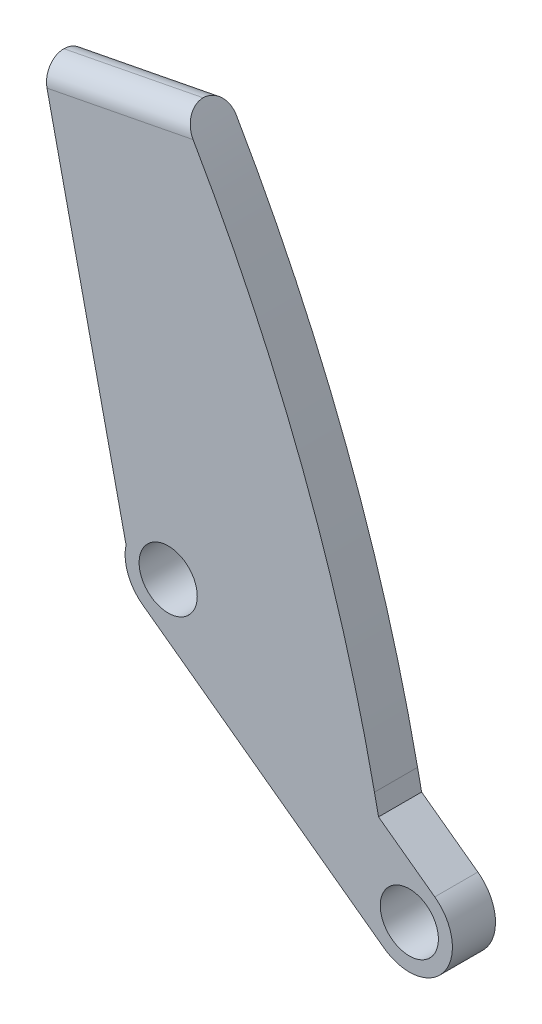
ISO-10303-21;
HEADER;
FILE_DESCRIPTION(('STEP AP214'),'2;1');
FILE_NAME('part.step','',(''),(''),'','','');
FILE_SCHEMA(('AUTOMOTIVE_DESIGN { 1 0 10303 214 1 1 1 1 }'));
ENDSEC;
DATA;
#1=APPLICATION_CONTEXT('core data for automotive mechanical design processes');
#2=APPLICATION_PROTOCOL_DEFINITION('international standard','automotive_design',2000,#1);
#3=PRODUCT_CONTEXT('',#1,'mechanical');
#4=PRODUCT('Part','Part','',(#3));
#5=PRODUCT_RELATED_PRODUCT_CATEGORY('part','',(#4));
#6=PRODUCT_DEFINITION_FORMATION('','',#4);
#7=PRODUCT_DEFINITION_CONTEXT('part definition',#1,'design');
#8=PRODUCT_DEFINITION('design','',#6,#7);
#9=PRODUCT_DEFINITION_SHAPE('','',#8);
#10=(LENGTH_UNIT() NAMED_UNIT(*) SI_UNIT(.MILLI.,.METRE.));
#11=(NAMED_UNIT(*) PLANE_ANGLE_UNIT() SI_UNIT($,.RADIAN.));
#12=(NAMED_UNIT(*) SI_UNIT($,.STERADIAN.) SOLID_ANGLE_UNIT());
#13=UNCERTAINTY_MEASURE_WITH_UNIT(LENGTH_MEASURE(1.E-05),#10,'distance_accuracy_value','');
#14=(GEOMETRIC_REPRESENTATION_CONTEXT(3) GLOBAL_UNCERTAINTY_ASSIGNED_CONTEXT((#13)) GLOBAL_UNIT_ASSIGNED_CONTEXT((#10,
#11,#12)) REPRESENTATION_CONTEXT('',''));
#15=CARTESIAN_POINT('',(0.,0.,0.));
#16=DIRECTION('',(0.,0.,1.));
#17=DIRECTION('',(1.,0.,0.));
#18=AXIS2_PLACEMENT_3D('',#15,#16,#17);
#19=CARTESIAN_POINT('',(-22.3860771891724,16.3777352873359,4.));
#20=DIRECTION('',(0.,0.,1.));
#21=DIRECTION('',(1.,0.,0.));
#22=AXIS2_PLACEMENT_3D('',#19,#20,#21);
#23=PLANE('',#22);
#24=CARTESIAN_POINT('',(-150.027791222216,-22.015529107945,4.));
#25=DIRECTION('',(0.,0.,1.));
#26=DIRECTION('',(1.,0.,0.));
#27=AXIS2_PLACEMENT_3D('',#24,#25,#26);
#28=CIRCLE('',#27,150.);
#29=CARTESIAN_POINT('',(-3.2367980067893,8.84551933226049,4.));
#30=VERTEX_POINT('',#29);
#31=CARTESIAN_POINT('',(-20.0719864820194,52.894342166327,4.));
#32=VERTEX_POINT('',#31);
#33=EDGE_CURVE('E167',#30,#32,#28,.T.);
#34=ORIENTED_EDGE('',*,*,#33,.T.);
#35=DIRECTION('',(-0.981560518740634,-0.191151636272403,0.));
#36=VECTOR('',#35,1.);
#37=CARTESIAN_POINT('',(-29.1530204691577,51.1258781006432,4.));
#38=LINE('',#37,#36);
#39=CARTESIAN_POINT('',(-33.635522206781,50.2529441089216,4.));
#40=VERTEX_POINT('',#39);
#41=EDGE_CURVE('E173',#32,#40,#38,.T.);
#42=ORIENTED_EDGE('',*,*,#41,.T.);
#43=DIRECTION('',(0.216697179931215,-0.976238870466577,0.));
#44=VECTOR('',#43,1.);
#45=CARTESIAN_POINT('',(-26.2997061545947,17.2044809078306,4.));
#46=LINE('',#45,#44);
#47=CARTESIAN_POINT('',(-26.2997061545947,17.2044809078306,4.));
#48=VERTEX_POINT('',#47);
#49=EDGE_CURVE('E135',#40,#48,#46,.T.);
#50=ORIENTED_EDGE('',*,*,#49,.T.);
#51=CARTESIAN_POINT('',(-22.3860771891724,16.3777352873359,4.));
#52=DIRECTION('',(0.,0.,1.));
#53=DIRECTION('',(1.,0.,0.));
#54=AXIS2_PLACEMENT_3D('',#51,#52,#53);
#55=CIRCLE('',#54,4.);
#56=CARTESIAN_POINT('',(-24.7478991474221,13.1494544696979,4.));
#57=VERTEX_POINT('',#56);
#58=EDGE_CURVE('E142',#48,#57,#55,.T.);
#59=ORIENTED_EDGE('',*,*,#58,.T.);
#60=DIRECTION('',(0.807070204409504,-0.590455489562423,0.));
#61=VECTOR('',#60,1.);
#62=CARTESIAN_POINT('',(-24.7478991474221,13.1494544696979,4.));
#63=LINE('',#62,#61);
#64=CARTESIAN_POINT('',(-2.36182195824969,-3.22828081763802,4.));
#65=VERTEX_POINT('',#64);
#66=EDGE_CURVE('E147',#57,#65,#63,.T.);
#67=ORIENTED_EDGE('',*,*,#66,.T.);
#68=CARTESIAN_POINT('',(0.,0.,4.));
#69=DIRECTION('',(0.,0.,1.));
#70=DIRECTION('',(1.,0.,0.));
#71=AXIS2_PLACEMENT_3D('',#68,#69,#70);
#72=CIRCLE('',#71,4.);
#73=CARTESIAN_POINT('',(2.36182195824969,3.22828081763802,4.));
#74=VERTEX_POINT('',#73);
#75=EDGE_CURVE('E244',#65,#74,#72,.T.);
#76=ORIENTED_EDGE('',*,*,#75,.T.);
#77=DIRECTION('',(-0.807070204409504,0.590455489562423,0.));
#78=VECTOR('',#77,1.);
#79=CARTESIAN_POINT('',(-20.0242552309227,19.6060161049739,4.));
#80=LINE('',#79,#78);
#81=CARTESIAN_POINT('',(-2.85883480044174,7.0477322426177,4.));
#82=VERTEX_POINT('',#81);
#83=EDGE_CURVE('E156',#74,#82,#80,.T.);
#84=ORIENTED_EDGE('',*,*,#83,.T.);
#85=DIRECTION('',(-0.205740322934703,0.978606621436174,0.));
#86=VECTOR('',#85,1.);
#87=CARTESIAN_POINT('',(-2.85883480044174,7.0477322426177,4.));
#88=LINE('',#87,#86);
#89=EDGE_CURVE('E119',#82,#30,#88,.T.);
#90=ORIENTED_EDGE('',*,*,#89,.T.);
#91=EDGE_LOOP('',(#34,#42,#50,#59,#67,#76,#84,#90));
#92=FACE_BOUND('',#91,.T.);
#93=CARTESIAN_POINT('',(0.,0.,4.));
#94=DIRECTION('',(0.,0.,1.));
#95=DIRECTION('',(1.,0.,0.));
#96=AXIS2_PLACEMENT_3D('',#93,#94,#95);
#97=CIRCLE('',#96,2.7);
#98=CARTESIAN_POINT('',(2.7,0.,4.));
#99=VERTEX_POINT('',#98);
#100=EDGE_CURVE('E253',#99,#99,#97,.T.);
#101=ORIENTED_EDGE('',*,*,#100,.F.);
#102=EDGE_LOOP('',(#101));
#103=FACE_BOUND('',#102,.T.);
#104=CARTESIAN_POINT('',(-22.3860771891724,16.3777352873359,4.));
#105=DIRECTION('',(0.,0.,1.));
#106=DIRECTION('',(1.,0.,0.));
#107=AXIS2_PLACEMENT_3D('',#104,#105,#106);
#108=CIRCLE('',#107,2.7);
#109=CARTESIAN_POINT('',(-19.6860771891724,16.3777352873359,4.));
#110=VERTEX_POINT('',#109);
#111=EDGE_CURVE('E263',#110,#110,#108,.T.);
#112=ORIENTED_EDGE('',*,*,#111,.F.);
#113=EDGE_LOOP('',(#112));
#114=FACE_BOUND('',#113,.T.);
#115=ADVANCED_FACE('F39',(#92,#103,#114),#23,.T.);
#116=CARTESIAN_POINT('',(-22.3860771891724,16.3777352873359,0.));
#117=DIRECTION('',(0.,0.,1.));
#118=DIRECTION('',(1.,0.,0.));
#119=AXIS2_PLACEMENT_3D('',#116,#117,#118);
#120=PLANE('',#119);
#121=DIRECTION('',(0.216697179931215,-0.976238870466577,0.));
#122=VECTOR('',#121,1.);
#123=CARTESIAN_POINT('',(-26.2997061545947,17.2044809078306,0.));
#124=LINE('',#123,#122);
#125=CARTESIAN_POINT('',(-33.635522206781,50.2529441089216,0.));
#126=VERTEX_POINT('',#125);
#127=CARTESIAN_POINT('',(-26.2997061545947,17.2044809078306,0.));
#128=VERTEX_POINT('',#127);
#129=EDGE_CURVE('E126',#126,#128,#124,.T.);
#130=ORIENTED_EDGE('',*,*,#129,.F.);
#131=DIRECTION('',(-0.981560518740634,-0.191151636272403,0.));
#132=VECTOR('',#131,1.);
#133=CARTESIAN_POINT('',(-20.7611964374901,52.76012363552,0.));
#134=LINE('',#133,#132);
#135=CARTESIAN_POINT('',(-20.0719864820194,52.894342166327,0.));
#136=VERTEX_POINT('',#135);
#137=EDGE_CURVE('E11',#126,#136,#134,.F.);
#138=ORIENTED_EDGE('',*,*,#137,.T.);
#139=CARTESIAN_POINT('',(-150.027791222216,-22.015529107945,0.));
#140=DIRECTION('',(0.,0.,1.));
#141=DIRECTION('',(1.,0.,0.));
#142=AXIS2_PLACEMENT_3D('',#139,#140,#141);
#143=CIRCLE('',#142,150.);
#144=CARTESIAN_POINT('',(-3.2367980067893,8.84551933226049,0.));
#145=VERTEX_POINT('',#144);
#146=EDGE_CURVE('E133',#136,#145,#143,.F.);
#147=ORIENTED_EDGE('',*,*,#146,.T.);
#148=DIRECTION('',(-0.205740322934703,0.978606621436174,0.));
#149=VECTOR('',#148,1.);
#150=CARTESIAN_POINT('',(-2.85883480044174,7.0477322426177,0.));
#151=LINE('',#150,#149);
#152=CARTESIAN_POINT('',(-2.85883480044174,7.0477322426177,0.));
#153=VERTEX_POINT('',#152);
#154=EDGE_CURVE('E116',#153,#145,#151,.T.);
#155=ORIENTED_EDGE('',*,*,#154,.F.);
#156=DIRECTION('',(-0.807070204409504,0.590455489562423,0.));
#157=VECTOR('',#156,1.);
#158=CARTESIAN_POINT('',(-20.0242552309227,19.6060161049739,0.));
#159=LINE('',#158,#157);
#160=CARTESIAN_POINT('',(2.36182195824969,3.22828081763802,0.));
#161=VERTEX_POINT('',#160);
#162=EDGE_CURVE('E132',#161,#153,#159,.T.);
#163=ORIENTED_EDGE('',*,*,#162,.F.);
#164=CARTESIAN_POINT('',(0.,0.,0.));
#165=DIRECTION('',(0.,0.,1.));
#166=DIRECTION('',(1.,0.,0.));
#167=AXIS2_PLACEMENT_3D('',#164,#165,#166);
#168=CIRCLE('',#167,4.);
#169=CARTESIAN_POINT('',(-2.36182195824969,-3.22828081763802,0.));
#170=VERTEX_POINT('',#169);
#171=EDGE_CURVE('E143',#170,#161,#168,.T.);
#172=ORIENTED_EDGE('',*,*,#171,.F.);
#173=DIRECTION('',(0.807070204409504,-0.590455489562423,0.));
#174=VECTOR('',#173,1.);
#175=CARTESIAN_POINT('',(-24.7478991474221,13.1494544696979,0.));
#176=LINE('',#175,#174);
#177=CARTESIAN_POINT('',(-24.7478991474221,13.1494544696979,0.));
#178=VERTEX_POINT('',#177);
#179=EDGE_CURVE('E149',#178,#170,#176,.T.);
#180=ORIENTED_EDGE('',*,*,#179,.F.);
#181=CARTESIAN_POINT('',(-22.3860771891724,16.3777352873359,0.));
#182=DIRECTION('',(0.,0.,1.));
#183=DIRECTION('',(1.,0.,0.));
#184=AXIS2_PLACEMENT_3D('',#181,#182,#183);
#185=CIRCLE('',#184,4.);
#186=EDGE_CURVE('E243',#128,#178,#185,.T.);
#187=ORIENTED_EDGE('',*,*,#186,.F.);
#188=EDGE_LOOP('',(#130,#138,#147,#155,#163,#172,#180,#187));
#189=FACE_BOUND('',#188,.T.);
#190=CARTESIAN_POINT('',(0.,0.,0.));
#191=DIRECTION('',(0.,0.,1.));
#192=DIRECTION('',(1.,0.,0.));
#193=AXIS2_PLACEMENT_3D('',#190,#191,#192);
#194=CIRCLE('',#193,2.7);
#195=CARTESIAN_POINT('',(2.7,0.,0.));
#196=VERTEX_POINT('',#195);
#197=EDGE_CURVE('E257',#196,#196,#194,.T.);
#198=ORIENTED_EDGE('',*,*,#197,.T.);
#199=EDGE_LOOP('',(#198));
#200=FACE_BOUND('',#199,.T.);
#201=CARTESIAN_POINT('',(-22.3860771891724,16.3777352873359,0.));
#202=DIRECTION('',(0.,0.,1.));
#203=DIRECTION('',(1.,0.,0.));
#204=AXIS2_PLACEMENT_3D('',#201,#202,#203);
#205=CIRCLE('',#204,2.7);
#206=CARTESIAN_POINT('',(-19.6860771891724,16.3777352873359,0.));
#207=VERTEX_POINT('',#206);
#208=EDGE_CURVE('E266',#207,#207,#205,.T.);
#209=ORIENTED_EDGE('',*,*,#208,.T.);
#210=EDGE_LOOP('',(#209));
#211=FACE_BOUND('',#210,.T.);
#212=ADVANCED_FACE('F129',(#189,#200,#211),#120,.F.);
#213=CARTESIAN_POINT('',(-22.3860771891724,16.3777352873359,4.));
#214=DIRECTION('',(0.,0.,-1.));
#215=DIRECTION('',(-1.,0.,0.));
#216=AXIS2_PLACEMENT_3D('',#213,#214,#215);
#217=CYLINDRICAL_SURFACE('',#216,4.);
#218=ORIENTED_EDGE('',*,*,#58,.F.);
#219=DIRECTION('',(0.,0.,1.));
#220=VECTOR('',#219,1.);
#221=CARTESIAN_POINT('',(-26.2997061545947,17.2044809078306,0.));
#222=LINE('',#221,#220);
#223=EDGE_CURVE('E125',#128,#48,#222,.T.);
#224=ORIENTED_EDGE('',*,*,#223,.F.);
#225=ORIENTED_EDGE('',*,*,#186,.T.);
#226=DIRECTION('',(0.,0.,-1.));
#227=VECTOR('',#226,1.);
#228=CARTESIAN_POINT('',(-24.7478991474221,13.1494544696979,4.));
#229=LINE('',#228,#227);
#230=EDGE_CURVE('E160',#57,#178,#229,.T.);
#231=ORIENTED_EDGE('',*,*,#230,.F.);
#232=EDGE_LOOP('',(#218,#224,#225,#231));
#233=FACE_BOUND('',#232,.T.);
#234=ADVANCED_FACE('F198',(#233),#217,.T.);
#235=CARTESIAN_POINT('',(-24.7478991474221,13.1494544696979,4.));
#236=DIRECTION('',(0.590455489562423,0.807070204409505,0.));
#237=DIRECTION('',(-0.807070204409504,0.590455489562423,0.));
#238=AXIS2_PLACEMENT_3D('',#235,#236,#237);
#239=PLANE('',#238);
#240=ORIENTED_EDGE('',*,*,#179,.T.);
#241=DIRECTION('',(0.,0.,-1.));
#242=VECTOR('',#241,1.);
#243=CARTESIAN_POINT('',(-2.36182195824969,-3.22828081763802,4.));
#244=LINE('',#243,#242);
#245=EDGE_CURVE('E155',#65,#170,#244,.T.);
#246=ORIENTED_EDGE('',*,*,#245,.F.);
#247=ORIENTED_EDGE('',*,*,#66,.F.);
#248=ORIENTED_EDGE('',*,*,#230,.T.);
#249=EDGE_LOOP('',(#240,#246,#247,#248));
#250=FACE_BOUND('',#249,.T.);
#251=ADVANCED_FACE('F227',(#250),#239,.F.);
#252=CARTESIAN_POINT('',(0.,0.,4.));
#253=DIRECTION('',(0.,0.,-1.));
#254=DIRECTION('',(-1.,0.,0.));
#255=AXIS2_PLACEMENT_3D('',#252,#253,#254);
#256=CYLINDRICAL_SURFACE('',#255,4.);
#257=ORIENTED_EDGE('',*,*,#171,.T.);
#258=DIRECTION('',(0.,0.,-1.));
#259=VECTOR('',#258,1.);
#260=CARTESIAN_POINT('',(2.36182195824969,3.22828081763802,4.));
#261=LINE('',#260,#259);
#262=EDGE_CURVE('E140',#74,#161,#261,.T.);
#263=ORIENTED_EDGE('',*,*,#262,.F.);
#264=ORIENTED_EDGE('',*,*,#75,.F.);
#265=ORIENTED_EDGE('',*,*,#245,.T.);
#266=EDGE_LOOP('',(#257,#263,#264,#265));
#267=FACE_BOUND('',#266,.T.);
#268=ADVANCED_FACE('F225',(#267),#256,.T.);
#269=CARTESIAN_POINT('',(-20.0242552309227,19.6060161049739,4.));
#270=DIRECTION('',(-0.590455489562423,-0.807070204409504,0.));
#271=DIRECTION('',(0.807070204409504,-0.590455489562423,0.));
#272=AXIS2_PLACEMENT_3D('',#269,#270,#271);
#273=PLANE('',#272);
#274=ORIENTED_EDGE('',*,*,#162,.T.);
#275=DIRECTION('',(0.,0.,1.));
#276=VECTOR('',#275,1.);
#277=CARTESIAN_POINT('',(-2.85883480044174,7.0477322426177,0.));
#278=LINE('',#277,#276);
#279=EDGE_CURVE('E112',#153,#82,#278,.T.);
#280=ORIENTED_EDGE('',*,*,#279,.T.);
#281=ORIENTED_EDGE('',*,*,#83,.F.);
#282=ORIENTED_EDGE('',*,*,#262,.T.);
#283=EDGE_LOOP('',(#274,#280,#281,#282));
#284=FACE_BOUND('',#283,.T.);
#285=ADVANCED_FACE('F138',(#284),#273,.F.);
#286=CARTESIAN_POINT('',(0.,0.,4.));
#287=DIRECTION('',(0.,0.,-1.));
#288=DIRECTION('',(-1.,0.,0.));
#289=AXIS2_PLACEMENT_3D('',#286,#287,#288);
#290=CYLINDRICAL_SURFACE('',#289,2.7);
#291=ORIENTED_EDGE('',*,*,#100,.T.);
#292=EDGE_LOOP('',(#291));
#293=FACE_BOUND('',#292,.T.);
#294=ORIENTED_EDGE('',*,*,#197,.F.);
#295=EDGE_LOOP('',(#294));
#296=FACE_BOUND('',#295,.T.);
#297=ADVANCED_FACE('F220',(#293,#296),#290,.F.);
#298=CARTESIAN_POINT('',(-22.3860771891724,16.3777352873359,4.));
#299=DIRECTION('',(0.,0.,-1.));
#300=DIRECTION('',(-1.,0.,0.));
#301=AXIS2_PLACEMENT_3D('',#298,#299,#300);
#302=CYLINDRICAL_SURFACE('',#301,2.7);
#303=ORIENTED_EDGE('',*,*,#111,.T.);
#304=EDGE_LOOP('',(#303));
#305=FACE_BOUND('',#304,.T.);
#306=ORIENTED_EDGE('',*,*,#208,.F.);
#307=EDGE_LOOP('',(#306));
#308=FACE_BOUND('',#307,.T.);
#309=ADVANCED_FACE('F291',(#305,#308),#302,.F.);
#310=CARTESIAN_POINT('',(-26.2997061545947,17.2044809078306,0.));
#311=DIRECTION('',(-0.976238870466577,-0.216697179931215,0.));
#312=DIRECTION('',(0.216697179931215,-0.976238870466577,0.));
#313=AXIS2_PLACEMENT_3D('',#310,#311,#312);
#314=PLANE('',#313);
#315=ORIENTED_EDGE('',*,*,#49,.F.);
#316=CARTESIAN_POINT('',(-33.635522206781,50.2529441089216,2.));
#317=DIRECTION('',(-0.976238870466577,-0.216697179931215,0.));
#318=DIRECTION('',(-0.216697179931215,0.976238870466577,0.));
#319=AXIS2_PLACEMENT_3D('',#316,#317,#318);
#320=ELLIPSE('',#319,2.00068112662895,2.);
#321=CARTESIAN_POINT('',(-34.0690641648631,52.2060867921456,2.));
#322=VERTEX_POINT('',#321);
#323=EDGE_CURVE('E180',#40,#322,#320,.T.);
#324=ORIENTED_EDGE('',*,*,#323,.T.);
#325=CARTESIAN_POINT('',(-33.635522206781,50.2529441089216,2.));
#326=DIRECTION('',(-0.976238870466577,-0.216697179931215,0.));
#327=DIRECTION('',(0.216697179931215,-0.976238870466577,0.));
#328=AXIS2_PLACEMENT_3D('',#325,#326,#327);
#329=ELLIPSE('',#328,2.00068112662895,2.);
#330=EDGE_CURVE('E177',#322,#126,#329,.T.);
#331=ORIENTED_EDGE('',*,*,#330,.T.);
#332=ORIENTED_EDGE('',*,*,#129,.T.);
#333=ORIENTED_EDGE('',*,*,#223,.T.);
#334=EDGE_LOOP('',(#315,#324,#331,#332,#333));
#335=FACE_BOUND('',#334,.T.);
#336=ADVANCED_FACE('F283',(#335),#314,.T.);
#337=CARTESIAN_POINT('',(-2.85883480044174,7.0477322426177,0.));
#338=DIRECTION('',(0.978606621436175,0.205740322934703,0.));
#339=DIRECTION('',(-0.205740322934703,0.978606621436175,0.));
#340=AXIS2_PLACEMENT_3D('',#337,#338,#339);
#341=PLANE('',#340);
#342=ORIENTED_EDGE('',*,*,#154,.T.);
#343=DIRECTION('',(0.,0.,1.));
#344=VECTOR('',#343,1.);
#345=CARTESIAN_POINT('',(-3.23679800678925,8.8455193322605,4.));
#346=LINE('',#345,#344);
#347=EDGE_CURVE('E164',#145,#30,#346,.T.);
#348=ORIENTED_EDGE('',*,*,#347,.T.);
#349=ORIENTED_EDGE('',*,*,#89,.F.);
#350=ORIENTED_EDGE('',*,*,#279,.F.);
#351=EDGE_LOOP('',(#342,#348,#349,#350));
#352=FACE_BOUND('',#351,.T.);
#353=ADVANCED_FACE('F114',(#352),#341,.T.);
#354=CARTESIAN_POINT('',(-150.027791222216,-22.015529107945,0.));
#355=DIRECTION('',(0.,0.,-1.));
#356=DIRECTION('',(-1.,0.,0.));
#357=AXIS2_PLACEMENT_3D('',#354,#355,#356);
#358=CYLINDRICAL_SURFACE('',#357,150.);
#359=CARTESIAN_POINT('',(-20.0719864820193,52.894342166327,0.));
#360=CARTESIAN_POINT('',(-20.1030789401304,52.9482826769143,2.28097465307526E-06));
#361=CARTESIAN_POINT('',(-20.1341905958895,53.0021779363888,0.00260238728320582));
#362=CARTESIAN_POINT('',(-20.1962647969689,53.1095571414512,0.0129811816137136));
#363=CARTESIAN_POINT('',(-20.227227335506,53.1630410683929,0.0207601030135137));
#364=CARTESIAN_POINT('',(-20.3196049252161,53.3223858199641,0.0518388464805727));
#365=CARTESIAN_POINT('',(-20.3805108159853,53.4271411165937,0.0828806488255453));
#366=CARTESIAN_POINT('',(-20.4990851171742,53.6305428556518,0.164999058386757));
#367=CARTESIAN_POINT('',(-20.5567503997628,53.7291834052869,0.216094654312344));
#368=CARTESIAN_POINT('',(-20.6669529893775,53.9172398477477,0.337224940081582));
#369=CARTESIAN_POINT('',(-20.7194934018594,54.0066613288362,0.407248062393502));
#370=CARTESIAN_POINT('',(-20.8163084123548,54.1710943529943,0.562515756873419));
#371=CARTESIAN_POINT('',(-20.8607648172018,54.2464243620116,0.64730896289007));
#372=CARTESIAN_POINT('',(-20.9413966478882,54.3828284150587,0.831181433578017));
#373=CARTESIAN_POINT('',(-20.9775720993821,54.4439025032537,0.9302606539894));
#374=CARTESIAN_POINT('',(-21.0383323451258,54.5463599770317,1.13389721971234));
#375=CARTESIAN_POINT('',(-21.063452571413,54.5886541751838,1.23783751400102));
#376=CARTESIAN_POINT('',(-21.1038454290655,54.6566156798094,1.4527541812116));
#377=CARTESIAN_POINT('',(-21.1191327938712,54.6823078628104,1.56371975218759));
#378=CARTESIAN_POINT('',(-21.1339390312603,54.7071855255862,1.72980743712456));
#379=CARTESIAN_POINT('',(-21.1375227065492,54.7132054908114,1.78364646715612));
#380=CARTESIAN_POINT('',(-21.1423014129475,54.7212321553644,1.89164736494966));
#381=CARTESIAN_POINT('',(-21.1434999900368,54.7232448124511,1.94580863320052));
#382=CARTESIAN_POINT('',(-21.1434997100349,54.7232446730013,2.));
#383=B_SPLINE_CURVE_WITH_KNOTS('',3,(#359,#360,#361,#362,#363,#364,#365,#366,#367,#368,#369,
#370,#371,#372,#373,#374,#375,#376,#377,#378,#379,#380,#381,#382),.UNSPECIFIED.,.F.,.F.,(4,2,2,
2,2,2,2,2,2,2,2,4),(0.,0.186666973243168,0.373342359006239,0.746687996810304,1.12038800757715,
1.49386014646054,1.85745847730326,2.22105568169569,2.56430101737977,2.90703083285176,
3.06973707861519,3.23220124402063),.UNSPECIFIED.);
#384=CARTESIAN_POINT('',(-21.1434997100349,54.7232446730013,2.));
#385=VERTEX_POINT('',#384);
#386=EDGE_CURVE('E57',#136,#385,#383,.T.);
#387=ORIENTED_EDGE('',*,*,#386,.T.);
#388=CARTESIAN_POINT('',(-21.1434997100349,54.7232446730013,2.));
#389=CARTESIAN_POINT('',(-21.143503759875,54.7232510388009,2.05389319193565));
#390=CARTESIAN_POINT('',(-21.1423157004183,54.7212560943638,2.10778273973867));
#391=CARTESIAN_POINT('',(-21.137586410141,54.7133125526207,2.21515673084399));
#392=CARTESIAN_POINT('',(-21.1340455839865,54.7073646352095,2.26864124221117));
#393=CARTESIAN_POINT('',(-21.1246529962955,54.6915829168604,2.3746995823457));
#394=CARTESIAN_POINT('',(-21.1188067637449,54.6817584129873,2.42727527808855));
#395=CARTESIAN_POINT('',(-21.1048686371028,54.6583270399064,2.53125889008386));
#396=CARTESIAN_POINT('',(-21.0967767162699,54.644720125658,2.58266679242247));
#397=CARTESIAN_POINT('',(-21.0692428809054,54.5983998951219,2.73458817839071));
#398=CARTESIAN_POINT('',(-21.0465330649291,54.5601706064993,2.83290870931336));
#399=CARTESIAN_POINT('',(-20.9932712466389,54.4703869890096,3.02090318648123));
#400=CARTESIAN_POINT('',(-20.9627169018892,54.418828679964,3.11057453899434));
#401=CARTESIAN_POINT('',(-20.8939461802074,54.3025862177919,3.28135763078633));
#402=CARTESIAN_POINT('',(-20.8555558141964,54.2376035034665,3.36219606217143));
#403=CARTESIAN_POINT('',(-20.7728645893856,54.0973512871971,3.51086921328862));
#404=CARTESIAN_POINT('',(-20.728562162063,54.0220790552226,3.57870047042222));
#405=CARTESIAN_POINT('',(-20.63274133953,53.8589098698441,3.703421673893));
#406=CARTESIAN_POINT('',(-20.5809588212946,53.7705439171111,3.75949464098071));
#407=CARTESIAN_POINT('',(-20.4737393519399,53.587109291457,3.85461342861406));
#408=CARTESIAN_POINT('',(-20.4183018488529,53.4920396060019,3.89365667055702));
#409=CARTESIAN_POINT('',(-20.3144112744092,53.3134023619709,3.94912886476665));
#410=CARTESIAN_POINT('',(-20.2662751109891,53.2304550103876,3.96819073481171));
#411=CARTESIAN_POINT('',(-20.16939554296,53.0631401126207,3.99362743723707));
#412=CARTESIAN_POINT('',(-20.1206530709521,52.9787746908161,4.00001979156481));
#413=CARTESIAN_POINT('',(-20.0719864820193,52.894342166327,4.));
#414=B_SPLINE_CURVE_WITH_KNOTS('',3,(#388,#389,#390,#391,#392,#393,#394,#395,#396,#397,#398,
#399,#400,#401,#402,#403,#404,#405,#406,#407,#408,#409,#410,#411,#412,#413),.UNSPECIFIED.,.F.,
.F.,(4,2,2,2,2,2,2,2,2,2,2,2,4),(0.,0.161623297860198,0.323218804385,0.484429095555249,
0.645641306483949,0.967736814980593,1.28992861572769,1.62025592112788,1.95067104020415,
2.2994384940471,2.64825873915608,2.94077778289295,3.23289198954659),.UNSPECIFIED.);
#415=EDGE_CURVE('E50',#385,#32,#414,.T.);
#416=ORIENTED_EDGE('',*,*,#415,.T.);
#417=ORIENTED_EDGE('',*,*,#33,.F.);
#418=ORIENTED_EDGE('',*,*,#347,.F.);
#419=ORIENTED_EDGE('',*,*,#146,.F.);
#420=EDGE_LOOP('',(#387,#416,#417,#418,#419));
#421=FACE_BOUND('',#420,.T.);
#422=ADVANCED_FACE('F194',(#421),#358,.T.);
#423=CARTESIAN_POINT('',(-20.7611964374901,52.76012363552,2.));
#424=DIRECTION('',(0.981560518740634,0.191151636272403,0.));
#425=DIRECTION('',(-0.191151636272403,0.981560518740634,0.));
#426=AXIS2_PLACEMENT_3D('',#423,#424,#425);
#427=CYLINDRICAL_SURFACE('',#426,2.);
#428=DIRECTION('',(-0.981560518740634,-0.191151636272403,0.));
#429=VECTOR('',#428,1.);
#430=CARTESIAN_POINT('',(-34.0690641648631,52.2060867921456,2.));
#431=LINE('',#430,#429);
#432=EDGE_CURVE('E44',#385,#322,#431,.T.);
#433=ORIENTED_EDGE('',*,*,#432,.F.);
#434=ORIENTED_EDGE('',*,*,#386,.F.);
#435=ORIENTED_EDGE('',*,*,#137,.F.);
#436=ORIENTED_EDGE('',*,*,#330,.F.);
#437=EDGE_LOOP('',(#433,#434,#435,#436));
#438=FACE_BOUND('',#437,.T.);
#439=ADVANCED_FACE('F41',(#438),#427,.T.);
#440=CARTESIAN_POINT('',(-29.1530204691577,51.1258781006432,2.));
#441=DIRECTION('',(-0.981560518740634,-0.191151636272403,0.));
#442=DIRECTION('',(0.191151636272403,-0.981560518740634,0.));
#443=AXIS2_PLACEMENT_3D('',#440,#441,#442);
#444=CYLINDRICAL_SURFACE('',#443,2.);
#445=ORIENTED_EDGE('',*,*,#415,.F.);
#446=ORIENTED_EDGE('',*,*,#432,.T.);
#447=ORIENTED_EDGE('',*,*,#323,.F.);
#448=ORIENTED_EDGE('',*,*,#41,.F.);
#449=EDGE_LOOP('',(#445,#446,#447,#448));
#450=FACE_BOUND('',#449,.T.);
#451=ADVANCED_FACE('F200',(#450),#444,.T.);
#452=CLOSED_SHELL('',(#115,#212,#234,#251,#268,#285,#297,#309,#336,#353,#422,#439,#451));
#453=MANIFOLD_SOLID_BREP('B2',#452);
#454=ADVANCED_BREP_SHAPE_REPRESENTATION('',(#18,#453),#14);
#455=SHAPE_DEFINITION_REPRESENTATION(#9,#454);
ENDSEC;
END-ISO-10303-21;
